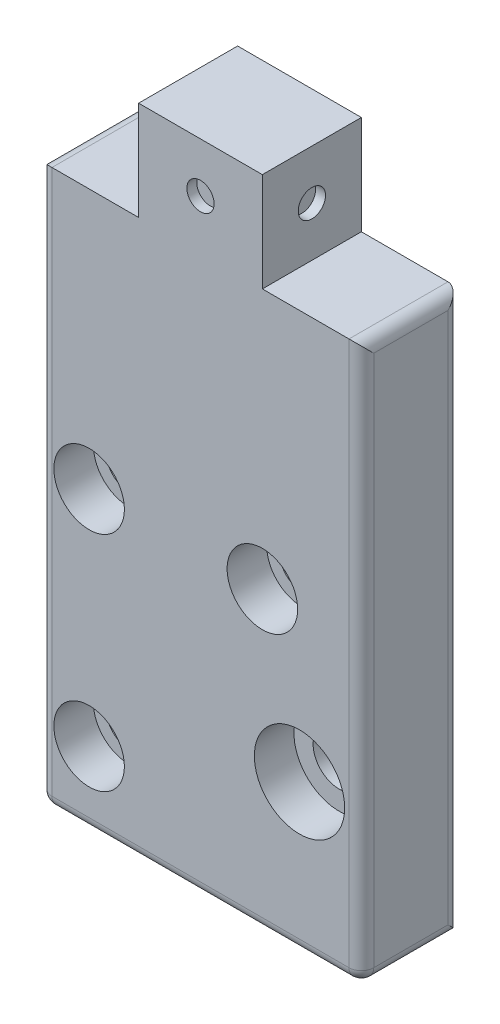
ISO-10303-21;
HEADER;
FILE_DESCRIPTION(('STEP AP214'),'2;1');
FILE_NAME('part.step','',(''),(''),'','','');
FILE_SCHEMA(('AUTOMOTIVE_DESIGN { 1 0 10303 214 1 1 1 1 }'));
ENDSEC;
DATA;
#1=APPLICATION_CONTEXT('core data for automotive mechanical design processes');
#2=APPLICATION_PROTOCOL_DEFINITION('international standard','automotive_design',2000,#1);
#3=PRODUCT_CONTEXT('',#1,'mechanical');
#4=PRODUCT('Part','Part','',(#3));
#5=PRODUCT_RELATED_PRODUCT_CATEGORY('part','',(#4));
#6=PRODUCT_DEFINITION_FORMATION('','',#4);
#7=PRODUCT_DEFINITION_CONTEXT('part definition',#1,'design');
#8=PRODUCT_DEFINITION('design','',#6,#7);
#9=PRODUCT_DEFINITION_SHAPE('','',#8);
#10=(LENGTH_UNIT() NAMED_UNIT(*) SI_UNIT(.MILLI.,.METRE.));
#11=(NAMED_UNIT(*) PLANE_ANGLE_UNIT() SI_UNIT($,.RADIAN.));
#12=(NAMED_UNIT(*) SI_UNIT($,.STERADIAN.) SOLID_ANGLE_UNIT());
#13=UNCERTAINTY_MEASURE_WITH_UNIT(LENGTH_MEASURE(1.E-05),#10,'distance_accuracy_value','');
#14=(GEOMETRIC_REPRESENTATION_CONTEXT(3) GLOBAL_UNCERTAINTY_ASSIGNED_CONTEXT((#13)) GLOBAL_UNIT_ASSIGNED_CONTEXT((#10,
#11,#12)) REPRESENTATION_CONTEXT('',''));
#15=CARTESIAN_POINT('',(0.,0.,0.));
#16=DIRECTION('',(0.,0.,1.));
#17=DIRECTION('',(1.,0.,0.));
#18=AXIS2_PLACEMENT_3D('',#15,#16,#17);
#19=CARTESIAN_POINT('',(5.08,7.62,10.16));
#20=DIRECTION('',(0.,0.,-1.));
#21=DIRECTION('',(-1.,0.,0.));
#22=AXIS2_PLACEMENT_3D('',#19,#20,#21);
#23=CYLINDRICAL_SURFACE('',#22,2.286);
#24=CARTESIAN_POINT('',(5.08,7.62,0.));
#25=DIRECTION('',(0.,0.,1.));
#26=DIRECTION('',(1.,0.,0.));
#27=AXIS2_PLACEMENT_3D('',#24,#25,#26);
#28=CIRCLE('',#27,2.286);
#29=CARTESIAN_POINT('',(7.366,7.62,0.));
#30=VERTEX_POINT('',#29);
#31=EDGE_CURVE('E166',#30,#30,#28,.T.);
#32=ORIENTED_EDGE('',*,*,#31,.F.);
#33=EDGE_LOOP('',(#32));
#34=FACE_BOUND('',#33,.T.);
#35=CARTESIAN_POINT('',(5.08,7.62,6.096));
#36=DIRECTION('',(0.,0.,1.));
#37=DIRECTION('',(1.,0.,0.));
#38=AXIS2_PLACEMENT_3D('',#35,#36,#37);
#39=CIRCLE('',#38,2.286);
#40=CARTESIAN_POINT('',(7.366,7.62,6.096));
#41=VERTEX_POINT('',#40);
#42=EDGE_CURVE('E194',#41,#41,#39,.T.);
#43=ORIENTED_EDGE('',*,*,#42,.T.);
#44=EDGE_LOOP('',(#43));
#45=FACE_BOUND('',#44,.T.);
#46=ADVANCED_FACE('F33',(#34,#45),#23,.F.);
#47=CARTESIAN_POINT('',(5.08,30.48,10.16));
#48=DIRECTION('',(0.,0.,-1.));
#49=DIRECTION('',(-1.,0.,0.));
#50=AXIS2_PLACEMENT_3D('',#47,#48,#49);
#51=CYLINDRICAL_SURFACE('',#50,2.286);
#52=CARTESIAN_POINT('',(5.08,30.48,0.));
#53=DIRECTION('',(0.,0.,1.));
#54=DIRECTION('',(1.,0.,0.));
#55=AXIS2_PLACEMENT_3D('',#52,#53,#54);
#56=CIRCLE('',#55,2.286);
#57=CARTESIAN_POINT('',(7.366,30.48,0.));
#58=VERTEX_POINT('',#57);
#59=EDGE_CURVE('E309',#58,#58,#56,.T.);
#60=ORIENTED_EDGE('',*,*,#59,.F.);
#61=EDGE_LOOP('',(#60));
#62=FACE_BOUND('',#61,.T.);
#63=CARTESIAN_POINT('',(5.08,30.48,6.096));
#64=DIRECTION('',(0.,0.,1.));
#65=DIRECTION('',(1.,0.,0.));
#66=AXIS2_PLACEMENT_3D('',#63,#64,#65);
#67=CIRCLE('',#66,2.286);
#68=CARTESIAN_POINT('',(7.366,30.48,6.096));
#69=VERTEX_POINT('',#68);
#70=EDGE_CURVE('E191',#69,#69,#67,.T.);
#71=ORIENTED_EDGE('',*,*,#70,.T.);
#72=EDGE_LOOP('',(#71));
#73=FACE_BOUND('',#72,.T.);
#74=ADVANCED_FACE('F319',(#62,#73),#51,.F.);
#75=CARTESIAN_POINT('',(26.67,15.24,10.16));
#76=DIRECTION('',(0.,0.,-1.));
#77=DIRECTION('',(-1.,0.,0.));
#78=AXIS2_PLACEMENT_3D('',#75,#76,#77);
#79=CYLINDRICAL_SURFACE('',#78,2.667);
#80=CARTESIAN_POINT('',(26.67,15.24,0.));
#81=DIRECTION('',(0.,0.,1.));
#82=DIRECTION('',(1.,0.,0.));
#83=AXIS2_PLACEMENT_3D('',#80,#81,#82);
#84=CIRCLE('',#83,2.667);
#85=CARTESIAN_POINT('',(29.337,15.24,0.));
#86=VERTEX_POINT('',#85);
#87=EDGE_CURVE('E306',#86,#86,#84,.T.);
#88=ORIENTED_EDGE('',*,*,#87,.F.);
#89=EDGE_LOOP('',(#88));
#90=FACE_BOUND('',#89,.T.);
#91=CARTESIAN_POINT('',(26.67,15.24,6.096));
#92=DIRECTION('',(0.,0.,1.));
#93=DIRECTION('',(1.,0.,0.));
#94=AXIS2_PLACEMENT_3D('',#91,#92,#93);
#95=CIRCLE('',#94,2.667);
#96=CARTESIAN_POINT('',(29.337,15.24,6.096));
#97=VERTEX_POINT('',#96);
#98=EDGE_CURVE('E187',#97,#97,#95,.T.);
#99=ORIENTED_EDGE('',*,*,#98,.T.);
#100=EDGE_LOOP('',(#99));
#101=FACE_BOUND('',#100,.T.);
#102=ADVANCED_FACE('F363',(#90,#101),#79,.F.);
#103=CARTESIAN_POINT('',(22.86,30.48,10.16));
#104=DIRECTION('',(0.,0.,-1.));
#105=DIRECTION('',(-1.,0.,0.));
#106=AXIS2_PLACEMENT_3D('',#103,#104,#105);
#107=CYLINDRICAL_SURFACE('',#106,2.286);
#108=CARTESIAN_POINT('',(22.86,30.48,0.));
#109=DIRECTION('',(0.,0.,1.));
#110=DIRECTION('',(1.,0.,0.));
#111=AXIS2_PLACEMENT_3D('',#108,#109,#110);
#112=CIRCLE('',#111,2.286);
#113=CARTESIAN_POINT('',(25.146,30.48,0.));
#114=VERTEX_POINT('',#113);
#115=EDGE_CURVE('E197',#114,#114,#112,.T.);
#116=ORIENTED_EDGE('',*,*,#115,.F.);
#117=EDGE_LOOP('',(#116));
#118=FACE_BOUND('',#117,.T.);
#119=CARTESIAN_POINT('',(22.86,30.48,6.096));
#120=DIRECTION('',(0.,0.,1.));
#121=DIRECTION('',(1.,0.,0.));
#122=AXIS2_PLACEMENT_3D('',#119,#120,#121);
#123=CIRCLE('',#122,2.286);
#124=CARTESIAN_POINT('',(25.146,30.48,6.096));
#125=VERTEX_POINT('',#124);
#126=EDGE_CURVE('E184',#125,#125,#123,.T.);
#127=ORIENTED_EDGE('',*,*,#126,.T.);
#128=EDGE_LOOP('',(#127));
#129=FACE_BOUND('',#128,.T.);
#130=ADVANCED_FACE('F339',(#118,#129),#107,.F.);
#131=CARTESIAN_POINT('',(0.,0.,10.16));
#132=DIRECTION('',(0.,0.,1.));
#133=DIRECTION('',(1.,0.,0.));
#134=AXIS2_PLACEMENT_3D('',#131,#132,#133);
#135=PLANE('',#134);
#136=DIRECTION('',(-1.,0.,0.));
#137=VECTOR('',#136,1.);
#138=CARTESIAN_POINT('',(0.,57.15,10.16));
#139=LINE('',#138,#137);
#140=CARTESIAN_POINT('',(10.16,57.15,10.16));
#141=VERTEX_POINT('',#140);
#142=CARTESIAN_POINT('',(1.27,57.15,10.16));
#143=VERTEX_POINT('',#142);
#144=EDGE_CURVE('E159',#141,#143,#139,.T.);
#145=ORIENTED_EDGE('',*,*,#144,.T.);
#146=DIRECTION('',(0.,-1.,0.));
#147=VECTOR('',#146,1.);
#148=CARTESIAN_POINT('',(1.27,0.,10.16));
#149=LINE('',#148,#147);
#150=CARTESIAN_POINT('',(1.27,1.27,10.16));
#151=VERTEX_POINT('',#150);
#152=EDGE_CURVE('E11',#143,#151,#149,.T.);
#153=ORIENTED_EDGE('',*,*,#152,.T.);
#154=DIRECTION('',(1.,0.,0.));
#155=VECTOR('',#154,1.);
#156=CARTESIAN_POINT('',(33.02,1.27,10.16));
#157=LINE('',#156,#155);
#158=CARTESIAN_POINT('',(31.75,1.27,10.16));
#159=VERTEX_POINT('',#158);
#160=EDGE_CURVE('E49',#151,#159,#157,.T.);
#161=ORIENTED_EDGE('',*,*,#160,.T.);
#162=DIRECTION('',(0.,1.,0.));
#163=VECTOR('',#162,1.);
#164=CARTESIAN_POINT('',(31.75,57.15,10.16));
#165=LINE('',#164,#163);
#166=CARTESIAN_POINT('',(31.75,57.15,10.16));
#167=VERTEX_POINT('',#166);
#168=EDGE_CURVE('E42',#159,#167,#165,.T.);
#169=ORIENTED_EDGE('',*,*,#168,.T.);
#170=DIRECTION('',(-1.,0.,0.));
#171=VECTOR('',#170,1.);
#172=CARTESIAN_POINT('',(22.86,57.15,10.16));
#173=LINE('',#172,#171);
#174=CARTESIAN_POINT('',(22.86,57.15,10.16));
#175=VERTEX_POINT('',#174);
#176=EDGE_CURVE('E126',#167,#175,#173,.T.);
#177=ORIENTED_EDGE('',*,*,#176,.T.);
#178=DIRECTION('',(0.,1.,0.));
#179=VECTOR('',#178,1.);
#180=CARTESIAN_POINT('',(22.86,67.31,10.16));
#181=LINE('',#180,#179);
#182=CARTESIAN_POINT('',(22.86,67.31,10.16));
#183=VERTEX_POINT('',#182);
#184=EDGE_CURVE('E131',#175,#183,#181,.T.);
#185=ORIENTED_EDGE('',*,*,#184,.T.);
#186=DIRECTION('',(-1.,0.,0.));
#187=VECTOR('',#186,1.);
#188=CARTESIAN_POINT('',(10.16,67.31,10.16));
#189=LINE('',#188,#187);
#190=CARTESIAN_POINT('',(10.16,67.31,10.16));
#191=VERTEX_POINT('',#190);
#192=EDGE_CURVE('E152',#183,#191,#189,.T.);
#193=ORIENTED_EDGE('',*,*,#192,.T.);
#194=DIRECTION('',(0.,-1.,0.));
#195=VECTOR('',#194,1.);
#196=CARTESIAN_POINT('',(10.16,57.15,10.16));
#197=LINE('',#196,#195);
#198=EDGE_CURVE('E154',#191,#141,#197,.T.);
#199=ORIENTED_EDGE('',*,*,#198,.T.);
#200=EDGE_LOOP('',(#145,#153,#161,#169,#177,#185,#193,#199));
#201=FACE_BOUND('',#200,.T.);
#202=CARTESIAN_POINT('',(16.51,62.23,10.16));
#203=DIRECTION('',(0.,0.,-1.));
#204=DIRECTION('',(-1.,0.,0.));
#205=AXIS2_PLACEMENT_3D('',#202,#203,#204);
#206=CIRCLE('',#205,1.397);
#207=CARTESIAN_POINT('',(15.113,62.23,10.16));
#208=VERTEX_POINT('',#207);
#209=EDGE_CURVE('E273',#208,#208,#206,.T.);
#210=ORIENTED_EDGE('',*,*,#209,.T.);
#211=EDGE_LOOP('',(#210));
#212=FACE_BOUND('',#211,.T.);
#213=CARTESIAN_POINT('',(22.86,30.48,10.16));
#214=DIRECTION('',(0.,0.,1.));
#215=DIRECTION('',(1.,0.,0.));
#216=AXIS2_PLACEMENT_3D('',#213,#214,#215);
#217=CIRCLE('',#216,3.6195);
#218=CARTESIAN_POINT('',(26.4795,30.48,10.16));
#219=VERTEX_POINT('',#218);
#220=EDGE_CURVE('E292',#219,#219,#217,.T.);
#221=ORIENTED_EDGE('',*,*,#220,.F.);
#222=EDGE_LOOP('',(#221));
#223=FACE_BOUND('',#222,.T.);
#224=CARTESIAN_POINT('',(5.08,7.62,10.16));
#225=DIRECTION('',(0.,0.,1.));
#226=DIRECTION('',(1.,0.,0.));
#227=AXIS2_PLACEMENT_3D('',#224,#225,#226);
#228=CIRCLE('',#227,3.6195);
#229=CARTESIAN_POINT('',(8.6995,7.62,10.16));
#230=VERTEX_POINT('',#229);
#231=EDGE_CURVE('E285',#230,#230,#228,.T.);
#232=ORIENTED_EDGE('',*,*,#231,.F.);
#233=EDGE_LOOP('',(#232));
#234=FACE_BOUND('',#233,.T.);
#235=CARTESIAN_POINT('',(26.67,15.24,10.16));
#236=DIRECTION('',(0.,0.,1.));
#237=DIRECTION('',(1.,0.,0.));
#238=AXIS2_PLACEMENT_3D('',#235,#236,#237);
#239=CIRCLE('',#238,4.6355);
#240=CARTESIAN_POINT('',(31.3055,15.24,10.16));
#241=VERTEX_POINT('',#240);
#242=EDGE_CURVE('E279',#241,#241,#239,.T.);
#243=ORIENTED_EDGE('',*,*,#242,.F.);
#244=EDGE_LOOP('',(#243));
#245=FACE_BOUND('',#244,.T.);
#246=CARTESIAN_POINT('',(5.08,30.48,10.16));
#247=DIRECTION('',(0.,0.,1.));
#248=DIRECTION('',(1.,0.,0.));
#249=AXIS2_PLACEMENT_3D('',#246,#247,#248);
#250=CIRCLE('',#249,3.6195);
#251=CARTESIAN_POINT('',(8.6995,30.48,10.16));
#252=VERTEX_POINT('',#251);
#253=EDGE_CURVE('E291',#252,#252,#250,.T.);
#254=ORIENTED_EDGE('',*,*,#253,.F.);
#255=EDGE_LOOP('',(#254));
#256=FACE_BOUND('',#255,.T.);
#257=ADVANCED_FACE('F128',(#201,#212,#223,#234,#245,#256),#135,.T.);
#258=CARTESIAN_POINT('',(0.,0.,0.));
#259=DIRECTION('',(0.,0.,1.));
#260=DIRECTION('',(1.,0.,0.));
#261=AXIS2_PLACEMENT_3D('',#258,#259,#260);
#262=PLANE('',#261);
#263=DIRECTION('',(0.,-1.,0.));
#264=VECTOR('',#263,1.);
#265=CARTESIAN_POINT('',(0.,57.15,0.));
#266=LINE('',#265,#264);
#267=CARTESIAN_POINT('',(0.,55.88,0.));
#268=VERTEX_POINT('',#267);
#269=CARTESIAN_POINT('',(0.,1.27,0.));
#270=VERTEX_POINT('',#269);
#271=EDGE_CURVE('E162',#268,#270,#266,.T.);
#272=ORIENTED_EDGE('',*,*,#271,.F.);
#273=CARTESIAN_POINT('',(1.27,55.88,0.));
#274=DIRECTION('',(0.,0.,1.));
#275=DIRECTION('',(1.,0.,0.));
#276=AXIS2_PLACEMENT_3D('',#273,#274,#275);
#277=CIRCLE('',#276,1.27);
#278=CARTESIAN_POINT('',(1.27,57.15,0.));
#279=VERTEX_POINT('',#278);
#280=EDGE_CURVE('E218',#268,#279,#277,.F.);
#281=ORIENTED_EDGE('',*,*,#280,.T.);
#282=DIRECTION('',(-1.,0.,0.));
#283=VECTOR('',#282,1.);
#284=CARTESIAN_POINT('',(0.,57.15,0.));
#285=LINE('',#284,#283);
#286=CARTESIAN_POINT('',(10.16,57.15,0.));
#287=VERTEX_POINT('',#286);
#288=EDGE_CURVE('E137',#287,#279,#285,.T.);
#289=ORIENTED_EDGE('',*,*,#288,.F.);
#290=DIRECTION('',(0.,-1.,0.));
#291=VECTOR('',#290,1.);
#292=CARTESIAN_POINT('',(10.16,57.15,0.));
#293=LINE('',#292,#291);
#294=CARTESIAN_POINT('',(10.16,67.31,0.));
#295=VERTEX_POINT('',#294);
#296=EDGE_CURVE('E174',#295,#287,#293,.T.);
#297=ORIENTED_EDGE('',*,*,#296,.F.);
#298=DIRECTION('',(-1.,0.,0.));
#299=VECTOR('',#298,1.);
#300=CARTESIAN_POINT('',(10.16,67.31,0.));
#301=LINE('',#300,#299);
#302=CARTESIAN_POINT('',(22.86,67.31,0.));
#303=VERTEX_POINT('',#302);
#304=EDGE_CURVE('E172',#303,#295,#301,.T.);
#305=ORIENTED_EDGE('',*,*,#304,.F.);
#306=DIRECTION('',(0.,1.,0.));
#307=VECTOR('',#306,1.);
#308=CARTESIAN_POINT('',(22.86,67.31,0.));
#309=LINE('',#308,#307);
#310=CARTESIAN_POINT('',(22.86,57.15,0.));
#311=VERTEX_POINT('',#310);
#312=EDGE_CURVE('E170',#311,#303,#309,.T.);
#313=ORIENTED_EDGE('',*,*,#312,.F.);
#314=DIRECTION('',(-1.,0.,0.));
#315=VECTOR('',#314,1.);
#316=CARTESIAN_POINT('',(22.86,57.15,0.));
#317=LINE('',#316,#315);
#318=CARTESIAN_POINT('',(31.75,57.15,0.));
#319=VERTEX_POINT('',#318);
#320=EDGE_CURVE('E143',#319,#311,#317,.T.);
#321=ORIENTED_EDGE('',*,*,#320,.F.);
#322=DIRECTION('',(0.,1.,0.));
#323=VECTOR('',#322,1.);
#324=CARTESIAN_POINT('',(31.75,0.,0.));
#325=LINE('',#324,#323);
#326=CARTESIAN_POINT('',(31.75,0.,0.));
#327=VERTEX_POINT('',#326);
#328=EDGE_CURVE('E214',#319,#327,#325,.F.);
#329=ORIENTED_EDGE('',*,*,#328,.T.);
#330=DIRECTION('',(1.,0.,0.));
#331=VECTOR('',#330,1.);
#332=CARTESIAN_POINT('',(0.,0.,0.));
#333=LINE('',#332,#331);
#334=CARTESIAN_POINT('',(1.27,0.,0.));
#335=VERTEX_POINT('',#334);
#336=EDGE_CURVE('E165',#335,#327,#333,.T.);
#337=ORIENTED_EDGE('',*,*,#336,.F.);
#338=CARTESIAN_POINT('',(1.27,1.27,0.));
#339=DIRECTION('',(0.,0.,1.));
#340=DIRECTION('',(1.,0.,0.));
#341=AXIS2_PLACEMENT_3D('',#338,#339,#340);
#342=CIRCLE('',#341,1.27);
#343=EDGE_CURVE('E216',#335,#270,#342,.F.);
#344=ORIENTED_EDGE('',*,*,#343,.T.);
#345=EDGE_LOOP('',(#272,#281,#289,#297,#305,#313,#321,#329,#337,#344));
#346=FACE_BOUND('',#345,.T.);
#347=ORIENTED_EDGE('',*,*,#31,.T.);
#348=EDGE_LOOP('',(#347));
#349=FACE_BOUND('',#348,.T.);
#350=ORIENTED_EDGE('',*,*,#59,.T.);
#351=EDGE_LOOP('',(#350));
#352=FACE_BOUND('',#351,.T.);
#353=ORIENTED_EDGE('',*,*,#87,.T.);
#354=EDGE_LOOP('',(#353));
#355=FACE_BOUND('',#354,.T.);
#356=ORIENTED_EDGE('',*,*,#115,.T.);
#357=EDGE_LOOP('',(#356));
#358=FACE_BOUND('',#357,.T.);
#359=ADVANCED_FACE('F314',(#346,#349,#352,#355,#358),#262,.F.);
#360=CARTESIAN_POINT('',(0.,57.15,10.16));
#361=DIRECTION('',(1.,0.,0.));
#362=DIRECTION('',(0.,0.,-1.));
#363=AXIS2_PLACEMENT_3D('',#360,#361,#362);
#364=PLANE('',#363);
#365=DIRECTION('',(0.,-1.,0.));
#366=VECTOR('',#365,1.);
#367=CARTESIAN_POINT('',(0.,57.15,8.89));
#368=LINE('',#367,#366);
#369=CARTESIAN_POINT('',(0.,1.27,8.89));
#370=VERTEX_POINT('',#369);
#371=CARTESIAN_POINT('',(0.,55.88,8.89));
#372=VERTEX_POINT('',#371);
#373=EDGE_CURVE('E208',#370,#372,#368,.F.);
#374=ORIENTED_EDGE('',*,*,#373,.T.);
#375=DIRECTION('',(0.,0.,-1.));
#376=VECTOR('',#375,1.);
#377=CARTESIAN_POINT('',(0.,55.88,10.16));
#378=LINE('',#377,#376);
#379=EDGE_CURVE('E212',#372,#268,#378,.T.);
#380=ORIENTED_EDGE('',*,*,#379,.T.);
#381=ORIENTED_EDGE('',*,*,#271,.T.);
#382=DIRECTION('',(0.,0.,-1.));
#383=VECTOR('',#382,1.);
#384=CARTESIAN_POINT('',(0.,1.27,10.16));
#385=LINE('',#384,#383);
#386=EDGE_CURVE('E210',#270,#370,#385,.F.);
#387=ORIENTED_EDGE('',*,*,#386,.T.);
#388=EDGE_LOOP('',(#374,#380,#381,#387));
#389=FACE_BOUND('',#388,.T.);
#390=ADVANCED_FACE('F373',(#389),#364,.F.);
#391=CARTESIAN_POINT('',(0.,0.,10.16));
#392=DIRECTION('',(0.,1.,0.));
#393=DIRECTION('',(0.,0.,1.));
#394=AXIS2_PLACEMENT_3D('',#391,#392,#393);
#395=PLANE('',#394);
#396=DIRECTION('',(1.,0.,0.));
#397=VECTOR('',#396,1.);
#398=CARTESIAN_POINT('',(0.,0.,8.89));
#399=LINE('',#398,#397);
#400=CARTESIAN_POINT('',(31.75,0.,8.89));
#401=VERTEX_POINT('',#400);
#402=CARTESIAN_POINT('',(1.27,0.,8.89));
#403=VERTEX_POINT('',#402);
#404=EDGE_CURVE('E222',#401,#403,#399,.F.);
#405=ORIENTED_EDGE('',*,*,#404,.T.);
#406=DIRECTION('',(0.,0.,-1.));
#407=VECTOR('',#406,1.);
#408=CARTESIAN_POINT('',(1.27,0.,10.16));
#409=LINE('',#408,#407);
#410=EDGE_CURVE('E226',#403,#335,#409,.T.);
#411=ORIENTED_EDGE('',*,*,#410,.T.);
#412=ORIENTED_EDGE('',*,*,#336,.T.);
#413=DIRECTION('',(0.,0.,-1.));
#414=VECTOR('',#413,1.);
#415=CARTESIAN_POINT('',(31.75,0.,10.16));
#416=LINE('',#415,#414);
#417=EDGE_CURVE('E224',#327,#401,#416,.F.);
#418=ORIENTED_EDGE('',*,*,#417,.T.);
#419=EDGE_LOOP('',(#405,#411,#412,#418));
#420=FACE_BOUND('',#419,.T.);
#421=ADVANCED_FACE('F396',(#420),#395,.F.);
#422=CARTESIAN_POINT('',(33.02,57.15,10.16));
#423=DIRECTION('',(-1.,0.,0.));
#424=DIRECTION('',(0.,-1.,0.));
#425=AXIS2_PLACEMENT_3D('',#422,#423,#424);
#426=PLANE('',#425);
#427=DIRECTION('',(0.,1.,0.));
#428=VECTOR('',#427,1.);
#429=CARTESIAN_POINT('',(33.02,57.15,1.27));
#430=LINE('',#429,#428);
#431=CARTESIAN_POINT('',(33.02,1.27,1.27));
#432=VERTEX_POINT('',#431);
#433=CARTESIAN_POINT('',(33.02,55.88,1.27));
#434=VERTEX_POINT('',#433);
#435=EDGE_CURVE('E203',#432,#434,#430,.T.);
#436=ORIENTED_EDGE('',*,*,#435,.T.);
#437=DIRECTION('',(0.,0.,-1.));
#438=VECTOR('',#437,1.);
#439=CARTESIAN_POINT('',(33.02,55.88,10.16));
#440=LINE('',#439,#438);
#441=CARTESIAN_POINT('',(33.02,55.88,8.89));
#442=VERTEX_POINT('',#441);
#443=EDGE_CURVE('E205',#434,#442,#440,.F.);
#444=ORIENTED_EDGE('',*,*,#443,.T.);
#445=DIRECTION('',(0.,1.,0.));
#446=VECTOR('',#445,1.);
#447=CARTESIAN_POINT('',(33.02,0.,8.89));
#448=LINE('',#447,#446);
#449=CARTESIAN_POINT('',(33.02,1.27,8.89));
#450=VERTEX_POINT('',#449);
#451=EDGE_CURVE('E199',#442,#450,#448,.F.);
#452=ORIENTED_EDGE('',*,*,#451,.T.);
#453=DIRECTION('',(0.,0.,-1.));
#454=VECTOR('',#453,1.);
#455=CARTESIAN_POINT('',(33.02,1.27,10.16));
#456=LINE('',#455,#454);
#457=EDGE_CURVE('E201',#450,#432,#456,.T.);
#458=ORIENTED_EDGE('',*,*,#457,.T.);
#459=EDGE_LOOP('',(#436,#444,#452,#458));
#460=FACE_BOUND('',#459,.T.);
#461=ADVANCED_FACE('F393',(#460),#426,.F.);
#462=CARTESIAN_POINT('',(22.86,57.15,10.16));
#463=DIRECTION('',(0.,-1.,0.));
#464=DIRECTION('',(1.,0.,0.));
#465=AXIS2_PLACEMENT_3D('',#462,#463,#464);
#466=PLANE('',#465);
#467=ORIENTED_EDGE('',*,*,#176,.F.);
#468=DIRECTION('',(0.,0.,-1.));
#469=VECTOR('',#468,1.);
#470=CARTESIAN_POINT('',(31.75,57.15,10.16));
#471=LINE('',#470,#469);
#472=EDGE_CURVE('E146',#167,#319,#471,.T.);
#473=ORIENTED_EDGE('',*,*,#472,.T.);
#474=ORIENTED_EDGE('',*,*,#320,.T.);
#475=DIRECTION('',(0.,0.,-1.));
#476=VECTOR('',#475,1.);
#477=CARTESIAN_POINT('',(22.86,57.15,10.16));
#478=LINE('',#477,#476);
#479=EDGE_CURVE('E140',#175,#311,#478,.T.);
#480=ORIENTED_EDGE('',*,*,#479,.F.);
#481=EDGE_LOOP('',(#467,#473,#474,#480));
#482=FACE_BOUND('',#481,.T.);
#483=ADVANCED_FACE('F141',(#482),#466,.F.);
#484=CARTESIAN_POINT('',(22.86,67.31,10.16));
#485=DIRECTION('',(-1.,0.,0.));
#486=DIRECTION('',(0.,0.,1.));
#487=AXIS2_PLACEMENT_3D('',#484,#485,#486);
#488=PLANE('',#487);
#489=CARTESIAN_POINT('',(22.86,62.23,5.08));
#490=DIRECTION('',(1.,0.,0.));
#491=DIRECTION('',(0.,0.,-1.));
#492=AXIS2_PLACEMENT_3D('',#489,#490,#491);
#493=CIRCLE('',#492,1.397);
#494=CARTESIAN_POINT('',(22.86,62.23,3.683));
#495=VERTEX_POINT('',#494);
#496=EDGE_CURVE('E267',#495,#495,#493,.T.);
#497=ORIENTED_EDGE('',*,*,#496,.F.);
#498=EDGE_LOOP('',(#497));
#499=FACE_BOUND('',#498,.T.);
#500=ORIENTED_EDGE('',*,*,#312,.T.);
#501=DIRECTION('',(0.,0.,-1.));
#502=VECTOR('',#501,1.);
#503=CARTESIAN_POINT('',(22.86,67.31,10.16));
#504=LINE('',#503,#502);
#505=EDGE_CURVE('E147',#183,#303,#504,.T.);
#506=ORIENTED_EDGE('',*,*,#505,.F.);
#507=ORIENTED_EDGE('',*,*,#184,.F.);
#508=ORIENTED_EDGE('',*,*,#479,.T.);
#509=EDGE_LOOP('',(#500,#506,#507,#508));
#510=FACE_BOUND('',#509,.T.);
#511=ADVANCED_FACE('F149',(#499,#510),#488,.F.);
#512=CARTESIAN_POINT('',(10.16,67.31,10.16));
#513=DIRECTION('',(0.,-1.,0.));
#514=DIRECTION('',(0.,0.,-1.));
#515=AXIS2_PLACEMENT_3D('',#512,#513,#514);
#516=PLANE('',#515);
#517=ORIENTED_EDGE('',*,*,#304,.T.);
#518=DIRECTION('',(0.,0.,-1.));
#519=VECTOR('',#518,1.);
#520=CARTESIAN_POINT('',(10.16,67.31,10.16));
#521=LINE('',#520,#519);
#522=EDGE_CURVE('E180',#191,#295,#521,.T.);
#523=ORIENTED_EDGE('',*,*,#522,.F.);
#524=ORIENTED_EDGE('',*,*,#192,.F.);
#525=ORIENTED_EDGE('',*,*,#505,.T.);
#526=EDGE_LOOP('',(#517,#523,#524,#525));
#527=FACE_BOUND('',#526,.T.);
#528=ADVANCED_FACE('F383',(#527),#516,.F.);
#529=CARTESIAN_POINT('',(10.16,57.15,10.16));
#530=DIRECTION('',(1.,0.,0.));
#531=DIRECTION('',(0.,0.,-1.));
#532=AXIS2_PLACEMENT_3D('',#529,#530,#531);
#533=PLANE('',#532);
#534=CARTESIAN_POINT('',(10.16,62.23,5.08));
#535=DIRECTION('',(-1.,0.,0.));
#536=DIRECTION('',(0.,0.,1.));
#537=AXIS2_PLACEMENT_3D('',#534,#535,#536);
#538=CIRCLE('',#537,1.397);
#539=CARTESIAN_POINT('',(10.16,62.23,6.477));
#540=VERTEX_POINT('',#539);
#541=EDGE_CURVE('E257',#540,#540,#538,.T.);
#542=ORIENTED_EDGE('',*,*,#541,.F.);
#543=EDGE_LOOP('',(#542));
#544=FACE_BOUND('',#543,.T.);
#545=ORIENTED_EDGE('',*,*,#296,.T.);
#546=DIRECTION('',(0.,0.,-1.));
#547=VECTOR('',#546,1.);
#548=CARTESIAN_POINT('',(10.16,57.15,10.16));
#549=LINE('',#548,#547);
#550=EDGE_CURVE('E161',#141,#287,#549,.T.);
#551=ORIENTED_EDGE('',*,*,#550,.F.);
#552=ORIENTED_EDGE('',*,*,#198,.F.);
#553=ORIENTED_EDGE('',*,*,#522,.T.);
#554=EDGE_LOOP('',(#545,#551,#552,#553));
#555=FACE_BOUND('',#554,.T.);
#556=ADVANCED_FACE('F379',(#544,#555),#533,.F.);
#557=CARTESIAN_POINT('',(0.,57.15,10.16));
#558=DIRECTION('',(0.,-1.,0.));
#559=DIRECTION('',(0.,0.,-1.));
#560=AXIS2_PLACEMENT_3D('',#557,#558,#559);
#561=PLANE('',#560);
#562=ORIENTED_EDGE('',*,*,#288,.T.);
#563=DIRECTION('',(0.,0.,-1.));
#564=VECTOR('',#563,1.);
#565=CARTESIAN_POINT('',(1.27,57.15,10.16));
#566=LINE('',#565,#564);
#567=EDGE_CURVE('E220',#279,#143,#566,.F.);
#568=ORIENTED_EDGE('',*,*,#567,.T.);
#569=ORIENTED_EDGE('',*,*,#144,.F.);
#570=ORIENTED_EDGE('',*,*,#550,.T.);
#571=EDGE_LOOP('',(#562,#568,#569,#570));
#572=FACE_BOUND('',#571,.T.);
#573=ADVANCED_FACE('F375',(#572),#561,.F.);
#574=CARTESIAN_POINT('',(22.86,30.48,6.096));
#575=DIRECTION('',(0.,0.,1.));
#576=DIRECTION('',(1.,0.,0.));
#577=AXIS2_PLACEMENT_3D('',#574,#575,#576);
#578=CYLINDRICAL_SURFACE('',#577,3.6195);
#579=CARTESIAN_POINT('',(22.86,30.48,6.096));
#580=DIRECTION('',(0.,0.,1.));
#581=DIRECTION('',(1.,0.,0.));
#582=AXIS2_PLACEMENT_3D('',#579,#580,#581);
#583=CIRCLE('',#582,3.6195);
#584=CARTESIAN_POINT('',(26.4795,30.48,6.096));
#585=VERTEX_POINT('',#584);
#586=EDGE_CURVE('E288',#585,#585,#583,.T.);
#587=ORIENTED_EDGE('',*,*,#586,.F.);
#588=EDGE_LOOP('',(#587));
#589=FACE_BOUND('',#588,.T.);
#590=ORIENTED_EDGE('',*,*,#220,.T.);
#591=EDGE_LOOP('',(#590));
#592=FACE_BOUND('',#591,.T.);
#593=ADVANCED_FACE('F378',(#589,#592),#578,.F.);
#594=CARTESIAN_POINT('',(22.86,30.48,6.096));
#595=DIRECTION('',(0.,0.,1.));
#596=DIRECTION('',(1.,0.,0.));
#597=AXIS2_PLACEMENT_3D('',#594,#595,#596);
#598=PLANE('',#597);
#599=ORIENTED_EDGE('',*,*,#126,.F.);
#600=EDGE_LOOP('',(#599));
#601=FACE_BOUND('',#600,.T.);
#602=ORIENTED_EDGE('',*,*,#586,.T.);
#603=EDGE_LOOP('',(#602));
#604=FACE_BOUND('',#603,.T.);
#605=ADVANCED_FACE('F498',(#601,#604),#598,.T.);
#606=CARTESIAN_POINT('',(26.67,15.24,6.096));
#607=DIRECTION('',(0.,0.,1.));
#608=DIRECTION('',(1.,0.,0.));
#609=AXIS2_PLACEMENT_3D('',#606,#607,#608);
#610=CYLINDRICAL_SURFACE('',#609,4.6355);
#611=CARTESIAN_POINT('',(26.67,15.24,6.096));
#612=DIRECTION('',(0.,0.,1.));
#613=DIRECTION('',(1.,0.,0.));
#614=AXIS2_PLACEMENT_3D('',#611,#612,#613);
#615=CIRCLE('',#614,4.6355);
#616=CARTESIAN_POINT('',(31.3055,15.24,6.096));
#617=VERTEX_POINT('',#616);
#618=EDGE_CURVE('E282',#617,#617,#615,.T.);
#619=ORIENTED_EDGE('',*,*,#618,.F.);
#620=EDGE_LOOP('',(#619));
#621=FACE_BOUND('',#620,.T.);
#622=ORIENTED_EDGE('',*,*,#242,.T.);
#623=EDGE_LOOP('',(#622));
#624=FACE_BOUND('',#623,.T.);
#625=ADVANCED_FACE('F356',(#621,#624),#610,.F.);
#626=CARTESIAN_POINT('',(26.67,15.24,6.096));
#627=DIRECTION('',(0.,0.,1.));
#628=DIRECTION('',(1.,0.,0.));
#629=AXIS2_PLACEMENT_3D('',#626,#627,#628);
#630=PLANE('',#629);
#631=ORIENTED_EDGE('',*,*,#98,.F.);
#632=EDGE_LOOP('',(#631));
#633=FACE_BOUND('',#632,.T.);
#634=ORIENTED_EDGE('',*,*,#618,.T.);
#635=EDGE_LOOP('',(#634));
#636=FACE_BOUND('',#635,.T.);
#637=ADVANCED_FACE('F347',(#633,#636),#630,.T.);
#638=CARTESIAN_POINT('',(5.08,30.48,6.096));
#639=DIRECTION('',(0.,0.,1.));
#640=DIRECTION('',(1.,0.,0.));
#641=AXIS2_PLACEMENT_3D('',#638,#639,#640);
#642=CYLINDRICAL_SURFACE('',#641,3.6195);
#643=CARTESIAN_POINT('',(5.08,30.48,6.096));
#644=DIRECTION('',(0.,0.,1.));
#645=DIRECTION('',(1.,0.,0.));
#646=AXIS2_PLACEMENT_3D('',#643,#644,#645);
#647=CIRCLE('',#646,3.6195);
#648=CARTESIAN_POINT('',(8.6995,30.48,6.096));
#649=VERTEX_POINT('',#648);
#650=EDGE_CURVE('E188',#649,#649,#647,.T.);
#651=ORIENTED_EDGE('',*,*,#650,.F.);
#652=EDGE_LOOP('',(#651));
#653=FACE_BOUND('',#652,.T.);
#654=ORIENTED_EDGE('',*,*,#253,.T.);
#655=EDGE_LOOP('',(#654));
#656=FACE_BOUND('',#655,.T.);
#657=ADVANCED_FACE('F345',(#653,#656),#642,.F.);
#658=CARTESIAN_POINT('',(5.08,30.48,6.096));
#659=DIRECTION('',(0.,0.,1.));
#660=DIRECTION('',(1.,0.,0.));
#661=AXIS2_PLACEMENT_3D('',#658,#659,#660);
#662=PLANE('',#661);
#663=ORIENTED_EDGE('',*,*,#70,.F.);
#664=EDGE_LOOP('',(#663));
#665=FACE_BOUND('',#664,.T.);
#666=ORIENTED_EDGE('',*,*,#650,.T.);
#667=EDGE_LOOP('',(#666));
#668=FACE_BOUND('',#667,.T.);
#669=ADVANCED_FACE('F333',(#665,#668),#662,.T.);
#670=CARTESIAN_POINT('',(5.08,7.62,6.096));
#671=DIRECTION('',(0.,0.,1.));
#672=DIRECTION('',(1.,0.,0.));
#673=AXIS2_PLACEMENT_3D('',#670,#671,#672);
#674=CYLINDRICAL_SURFACE('',#673,3.6195);
#675=CARTESIAN_POINT('',(5.08,7.62,6.096));
#676=DIRECTION('',(0.,0.,1.));
#677=DIRECTION('',(1.,0.,0.));
#678=AXIS2_PLACEMENT_3D('',#675,#676,#677);
#679=CIRCLE('',#678,3.6195);
#680=CARTESIAN_POINT('',(8.6995,7.62,6.096));
#681=VERTEX_POINT('',#680);
#682=EDGE_CURVE('E295',#681,#681,#679,.T.);
#683=ORIENTED_EDGE('',*,*,#682,.F.);
#684=EDGE_LOOP('',(#683));
#685=FACE_BOUND('',#684,.T.);
#686=ORIENTED_EDGE('',*,*,#231,.T.);
#687=EDGE_LOOP('',(#686));
#688=FACE_BOUND('',#687,.T.);
#689=ADVANCED_FACE('F327',(#685,#688),#674,.F.);
#690=CARTESIAN_POINT('',(5.08,7.62,6.096));
#691=DIRECTION('',(0.,0.,1.));
#692=DIRECTION('',(1.,0.,0.));
#693=AXIS2_PLACEMENT_3D('',#690,#691,#692);
#694=PLANE('',#693);
#695=ORIENTED_EDGE('',*,*,#42,.F.);
#696=EDGE_LOOP('',(#695));
#697=FACE_BOUND('',#696,.T.);
#698=ORIENTED_EDGE('',*,*,#682,.T.);
#699=EDGE_LOOP('',(#698));
#700=FACE_BOUND('',#699,.T.);
#701=ADVANCED_FACE('F323',(#697,#700),#694,.T.);
#702=CARTESIAN_POINT('',(16.51,62.23,9.144));
#703=DIRECTION('',(0.,0.,1.));
#704=DIRECTION('',(1.,0.,0.));
#705=AXIS2_PLACEMENT_3D('',#702,#703,#704);
#706=CYLINDRICAL_SURFACE('',#705,1.397);
#707=CARTESIAN_POINT('',(16.51,62.23,9.144));
#708=DIRECTION('',(0.,0.,-1.));
#709=DIRECTION('',(-1.,0.,0.));
#710=AXIS2_PLACEMENT_3D('',#707,#708,#709);
#711=CIRCLE('',#710,1.397);
#712=CARTESIAN_POINT('',(15.113,62.23,9.144));
#713=VERTEX_POINT('',#712);
#714=EDGE_CURVE('E276',#713,#713,#711,.T.);
#715=ORIENTED_EDGE('',*,*,#714,.T.);
#716=EDGE_LOOP('',(#715));
#717=FACE_BOUND('',#716,.T.);
#718=ORIENTED_EDGE('',*,*,#209,.F.);
#719=EDGE_LOOP('',(#718));
#720=FACE_BOUND('',#719,.T.);
#721=ADVANCED_FACE('F326',(#717,#720),#706,.F.);
#722=CARTESIAN_POINT('',(16.51,62.23,9.144));
#723=DIRECTION('',(0.,0.,-1.));
#724=DIRECTION('',(-1.,0.,0.));
#725=AXIS2_PLACEMENT_3D('',#722,#723,#724);
#726=PLANE('',#725);
#727=ORIENTED_EDGE('',*,*,#714,.F.);
#728=EDGE_LOOP('',(#727));
#729=FACE_BOUND('',#728,.T.);
#730=ADVANCED_FACE('F488',(#729),#726,.F.);
#731=CARTESIAN_POINT('',(21.844,62.23,5.08));
#732=DIRECTION('',(1.,0.,0.));
#733=DIRECTION('',(0.,0.,-1.));
#734=AXIS2_PLACEMENT_3D('',#731,#732,#733);
#735=CYLINDRICAL_SURFACE('',#734,1.397);
#736=CARTESIAN_POINT('',(21.844,62.23,5.08));
#737=DIRECTION('',(1.,0.,0.));
#738=DIRECTION('',(0.,0.,-1.));
#739=AXIS2_PLACEMENT_3D('',#736,#737,#738);
#740=CIRCLE('',#739,1.397);
#741=CARTESIAN_POINT('',(21.844,62.23,3.683));
#742=VERTEX_POINT('',#741);
#743=EDGE_CURVE('E270',#742,#742,#740,.T.);
#744=ORIENTED_EDGE('',*,*,#743,.F.);
#745=EDGE_LOOP('',(#744));
#746=FACE_BOUND('',#745,.T.);
#747=ORIENTED_EDGE('',*,*,#496,.T.);
#748=EDGE_LOOP('',(#747));
#749=FACE_BOUND('',#748,.T.);
#750=ADVANCED_FACE('F484',(#746,#749),#735,.F.);
#751=CARTESIAN_POINT('',(21.844,62.23,5.08));
#752=DIRECTION('',(1.,0.,0.));
#753=DIRECTION('',(0.,0.,-1.));
#754=AXIS2_PLACEMENT_3D('',#751,#752,#753);
#755=PLANE('',#754);
#756=ORIENTED_EDGE('',*,*,#743,.T.);
#757=EDGE_LOOP('',(#756));
#758=FACE_BOUND('',#757,.T.);
#759=ADVANCED_FACE('F478',(#758),#755,.T.);
#760=CARTESIAN_POINT('',(11.176,62.23,5.08));
#761=DIRECTION('',(-1.,0.,0.));
#762=DIRECTION('',(0.,0.,1.));
#763=AXIS2_PLACEMENT_3D('',#760,#761,#762);
#764=CYLINDRICAL_SURFACE('',#763,1.397);
#765=CARTESIAN_POINT('',(11.176,62.23,5.08));
#766=DIRECTION('',(-1.,0.,0.));
#767=DIRECTION('',(0.,0.,1.));
#768=AXIS2_PLACEMENT_3D('',#765,#766,#767);
#769=CIRCLE('',#768,1.397);
#770=CARTESIAN_POINT('',(11.176,62.23,6.477));
#771=VERTEX_POINT('',#770);
#772=EDGE_CURVE('E262',#771,#771,#769,.T.);
#773=ORIENTED_EDGE('',*,*,#772,.F.);
#774=EDGE_LOOP('',(#773));
#775=FACE_BOUND('',#774,.T.);
#776=ORIENTED_EDGE('',*,*,#541,.T.);
#777=EDGE_LOOP('',(#776));
#778=FACE_BOUND('',#777,.T.);
#779=ADVANCED_FACE('F472',(#775,#778),#764,.F.);
#780=CARTESIAN_POINT('',(11.176,62.23,5.08));
#781=DIRECTION('',(-1.,0.,0.));
#782=DIRECTION('',(0.,0.,1.));
#783=AXIS2_PLACEMENT_3D('',#780,#781,#782);
#784=PLANE('',#783);
#785=ORIENTED_EDGE('',*,*,#772,.T.);
#786=EDGE_LOOP('',(#785));
#787=FACE_BOUND('',#786,.T.);
#788=ADVANCED_FACE('F439',(#787),#784,.T.);
#789=CARTESIAN_POINT('',(1.27,55.88,10.16));
#790=DIRECTION('',(0.,0.,-1.));
#791=DIRECTION('',(-1.,0.,0.));
#792=AXIS2_PLACEMENT_3D('',#789,#790,#791);
#793=CYLINDRICAL_SURFACE('',#792,1.27);
#794=ORIENTED_EDGE('',*,*,#280,.F.);
#795=ORIENTED_EDGE('',*,*,#379,.F.);
#796=CARTESIAN_POINT('',(1.27,55.88,8.89));
#797=DIRECTION('',(0.,0.707106781186547,-0.707106781186547));
#798=DIRECTION('',(0.,0.707106781186547,0.707106781186547));
#799=AXIS2_PLACEMENT_3D('',#796,#797,#798);
#800=ELLIPSE('',#799,1.79605122421383,1.27);
#801=EDGE_CURVE('E37',#143,#372,#800,.F.);
#802=ORIENTED_EDGE('',*,*,#801,.F.);
#803=ORIENTED_EDGE('',*,*,#567,.F.);
#804=EDGE_LOOP('',(#794,#795,#802,#803));
#805=FACE_BOUND('',#804,.T.);
#806=ADVANCED_FACE('F35',(#805),#793,.T.);
#807=CARTESIAN_POINT('',(1.27,1.27,10.16));
#808=DIRECTION('',(0.,0.,-1.));
#809=DIRECTION('',(-1.,0.,0.));
#810=AXIS2_PLACEMENT_3D('',#807,#808,#809);
#811=CYLINDRICAL_SURFACE('',#810,1.27);
#812=ORIENTED_EDGE('',*,*,#343,.F.);
#813=ORIENTED_EDGE('',*,*,#410,.F.);
#814=CARTESIAN_POINT('',(1.27,1.27,8.89));
#815=DIRECTION('',(0.,0.,1.));
#816=DIRECTION('',(1.,0.,0.));
#817=AXIS2_PLACEMENT_3D('',#814,#815,#816);
#818=CIRCLE('',#817,1.27);
#819=EDGE_CURVE('E251',#370,#403,#818,.T.);
#820=ORIENTED_EDGE('',*,*,#819,.F.);
#821=ORIENTED_EDGE('',*,*,#386,.F.);
#822=EDGE_LOOP('',(#812,#813,#820,#821));
#823=FACE_BOUND('',#822,.T.);
#824=ADVANCED_FACE('F433',(#823),#811,.T.);
#825=CARTESIAN_POINT('',(1.27,0.,8.89));
#826=DIRECTION('',(0.,1.,0.));
#827=DIRECTION('',(0.,0.,1.));
#828=AXIS2_PLACEMENT_3D('',#825,#826,#827);
#829=CYLINDRICAL_SURFACE('',#828,1.27);
#830=ORIENTED_EDGE('',*,*,#801,.T.);
#831=ORIENTED_EDGE('',*,*,#373,.F.);
#832=CARTESIAN_POINT('',(1.27,1.27,8.89));
#833=DIRECTION('',(0.,-1.,0.));
#834=DIRECTION('',(0.,0.,-1.));
#835=AXIS2_PLACEMENT_3D('',#832,#833,#834);
#836=CIRCLE('',#835,1.27);
#837=EDGE_CURVE('E249',#151,#370,#836,.T.);
#838=ORIENTED_EDGE('',*,*,#837,.F.);
#839=ORIENTED_EDGE('',*,*,#152,.F.);
#840=EDGE_LOOP('',(#830,#831,#838,#839));
#841=FACE_BOUND('',#840,.T.);
#842=ADVANCED_FACE('F431',(#841),#829,.T.);
#843=CARTESIAN_POINT('',(1.27,1.27,8.89));
#844=DIRECTION('',(0.,0.,1.));
#845=DIRECTION('',(1.,0.,0.));
#846=AXIS2_PLACEMENT_3D('',#843,#844,#845);
#847=SPHERICAL_SURFACE('',#846,1.27);
#848=ORIENTED_EDGE('',*,*,#837,.T.);
#849=ORIENTED_EDGE('',*,*,#819,.T.);
#850=CARTESIAN_POINT('',(1.27,1.27,8.89));
#851=DIRECTION('',(-1.,0.,0.));
#852=DIRECTION('',(0.,0.,1.));
#853=AXIS2_PLACEMENT_3D('',#850,#851,#852);
#854=CIRCLE('',#853,1.27);
#855=EDGE_CURVE('E246',#151,#403,#854,.F.);
#856=ORIENTED_EDGE('',*,*,#855,.F.);
#857=EDGE_LOOP('',(#848,#849,#856));
#858=FACE_BOUND('',#857,.T.);
#859=ADVANCED_FACE('F427',(#858),#847,.T.);
#860=CARTESIAN_POINT('',(0.,1.27,8.89));
#861=DIRECTION('',(-1.,0.,0.));
#862=DIRECTION('',(0.,0.,1.));
#863=AXIS2_PLACEMENT_3D('',#860,#861,#862);
#864=CYLINDRICAL_SURFACE('',#863,1.27);
#865=CARTESIAN_POINT('',(31.75,1.27,8.89));
#866=DIRECTION('',(1.,0.,0.));
#867=DIRECTION('',(0.,0.,-1.));
#868=AXIS2_PLACEMENT_3D('',#865,#866,#867);
#869=CIRCLE('',#868,1.27);
#870=EDGE_CURVE('E243',#159,#401,#869,.T.);
#871=ORIENTED_EDGE('',*,*,#870,.F.);
#872=ORIENTED_EDGE('',*,*,#160,.F.);
#873=ORIENTED_EDGE('',*,*,#855,.T.);
#874=ORIENTED_EDGE('',*,*,#404,.F.);
#875=EDGE_LOOP('',(#871,#872,#873,#874));
#876=FACE_BOUND('',#875,.T.);
#877=ADVANCED_FACE('F423',(#876),#864,.T.);
#878=CARTESIAN_POINT('',(31.75,1.27,8.89));
#879=DIRECTION('',(0.,0.,1.));
#880=DIRECTION('',(1.,0.,0.));
#881=AXIS2_PLACEMENT_3D('',#878,#879,#880);
#882=SPHERICAL_SURFACE('',#881,1.27);
#883=CARTESIAN_POINT('',(31.75,1.27,8.89));
#884=DIRECTION('',(0.,-1.,0.));
#885=DIRECTION('',(0.,0.,-1.));
#886=AXIS2_PLACEMENT_3D('',#883,#884,#885);
#887=CIRCLE('',#886,1.27);
#888=EDGE_CURVE('E237',#159,#450,#887,.F.);
#889=ORIENTED_EDGE('',*,*,#888,.F.);
#890=ORIENTED_EDGE('',*,*,#870,.T.);
#891=CARTESIAN_POINT('',(31.75,1.27,8.89));
#892=DIRECTION('',(0.,0.,1.));
#893=DIRECTION('',(1.,0.,0.));
#894=AXIS2_PLACEMENT_3D('',#891,#892,#893);
#895=CIRCLE('',#894,1.27);
#896=EDGE_CURVE('E240',#450,#401,#895,.F.);
#897=ORIENTED_EDGE('',*,*,#896,.F.);
#898=EDGE_LOOP('',(#889,#890,#897));
#899=FACE_BOUND('',#898,.T.);
#900=ADVANCED_FACE('F419',(#899),#882,.T.);
#901=CARTESIAN_POINT('',(31.75,1.27,10.16));
#902=DIRECTION('',(0.,0.,-1.));
#903=DIRECTION('',(-1.,0.,0.));
#904=AXIS2_PLACEMENT_3D('',#901,#902,#903);
#905=CYLINDRICAL_SURFACE('',#904,1.27);
#906=ORIENTED_EDGE('',*,*,#896,.T.);
#907=ORIENTED_EDGE('',*,*,#417,.F.);
#908=CARTESIAN_POINT('',(31.75,1.27,1.27));
#909=DIRECTION('',(0.,0.707106781186547,-0.707106781186547));
#910=DIRECTION('',(0.,-0.707106781186547,-0.707106781186547));
#911=AXIS2_PLACEMENT_3D('',#908,#909,#910);
#912=ELLIPSE('',#911,1.79605122421383,1.27);
#913=EDGE_CURVE('E234',#432,#327,#912,.T.);
#914=ORIENTED_EDGE('',*,*,#913,.F.);
#915=ORIENTED_EDGE('',*,*,#457,.F.);
#916=EDGE_LOOP('',(#906,#907,#914,#915));
#917=FACE_BOUND('',#916,.T.);
#918=ADVANCED_FACE('F415',(#917),#905,.T.);
#919=CARTESIAN_POINT('',(31.75,0.,8.89));
#920=DIRECTION('',(0.,-1.,0.));
#921=DIRECTION('',(1.,0.,0.));
#922=AXIS2_PLACEMENT_3D('',#919,#920,#921);
#923=CYLINDRICAL_SURFACE('',#922,1.27);
#924=ORIENTED_EDGE('',*,*,#888,.T.);
#925=ORIENTED_EDGE('',*,*,#451,.F.);
#926=CARTESIAN_POINT('',(31.75,55.88,8.89));
#927=DIRECTION('',(0.,-0.707106781186547,0.707106781186547));
#928=DIRECTION('',(0.,-0.707106781186547,-0.707106781186547));
#929=AXIS2_PLACEMENT_3D('',#926,#927,#928);
#930=ELLIPSE('',#929,1.79605122421383,1.27);
#931=EDGE_CURVE('E232',#167,#442,#930,.F.);
#932=ORIENTED_EDGE('',*,*,#931,.F.);
#933=ORIENTED_EDGE('',*,*,#168,.F.);
#934=EDGE_LOOP('',(#924,#925,#932,#933));
#935=FACE_BOUND('',#934,.T.);
#936=ADVANCED_FACE('F411',(#935),#923,.T.);
#937=CARTESIAN_POINT('',(31.75,57.15,1.27));
#938=DIRECTION('',(0.,1.,0.));
#939=DIRECTION('',(-1.,0.,0.));
#940=AXIS2_PLACEMENT_3D('',#937,#938,#939);
#941=CYLINDRICAL_SURFACE('',#940,1.27);
#942=ORIENTED_EDGE('',*,*,#913,.T.);
#943=ORIENTED_EDGE('',*,*,#328,.F.);
#944=CARTESIAN_POINT('',(31.75,55.88,1.27));
#945=DIRECTION('',(0.,0.707106781186547,0.707106781186547));
#946=DIRECTION('',(0.,0.707106781186547,-0.707106781186547));
#947=AXIS2_PLACEMENT_3D('',#944,#945,#946);
#948=ELLIPSE('',#947,1.79605122421383,1.27);
#949=EDGE_CURVE('E230',#434,#319,#948,.T.);
#950=ORIENTED_EDGE('',*,*,#949,.F.);
#951=ORIENTED_EDGE('',*,*,#435,.F.);
#952=EDGE_LOOP('',(#942,#943,#950,#951));
#953=FACE_BOUND('',#952,.T.);
#954=ADVANCED_FACE('F407',(#953),#941,.T.);
#955=CARTESIAN_POINT('',(31.75,55.88,10.16));
#956=DIRECTION('',(0.,0.,-1.));
#957=DIRECTION('',(-1.,0.,0.));
#958=AXIS2_PLACEMENT_3D('',#955,#956,#957);
#959=CYLINDRICAL_SURFACE('',#958,1.27);
#960=ORIENTED_EDGE('',*,*,#931,.T.);
#961=ORIENTED_EDGE('',*,*,#443,.F.);
#962=ORIENTED_EDGE('',*,*,#949,.T.);
#963=ORIENTED_EDGE('',*,*,#472,.F.);
#964=EDGE_LOOP('',(#960,#961,#962,#963));
#965=FACE_BOUND('',#964,.T.);
#966=ADVANCED_FACE('F404',(#965),#959,.T.);
#967=CLOSED_SHELL('',(#46,#74,#102,#130,#257,#359,#390,#421,#461,#483,#511,#528,#556,#573,#593,
#605,#625,#637,#657,#669,#689,#701,#721,#730,#750,#759,#779,#788,#806,#824,#842,#859,#877,#900,
#918,#936,#954,#966));
#968=MANIFOLD_SOLID_BREP('B2',#967);
#969=ADVANCED_BREP_SHAPE_REPRESENTATION('',(#18,#968),#14);
#970=SHAPE_DEFINITION_REPRESENTATION(#9,#969);
ENDSEC;
END-ISO-10303-21;
